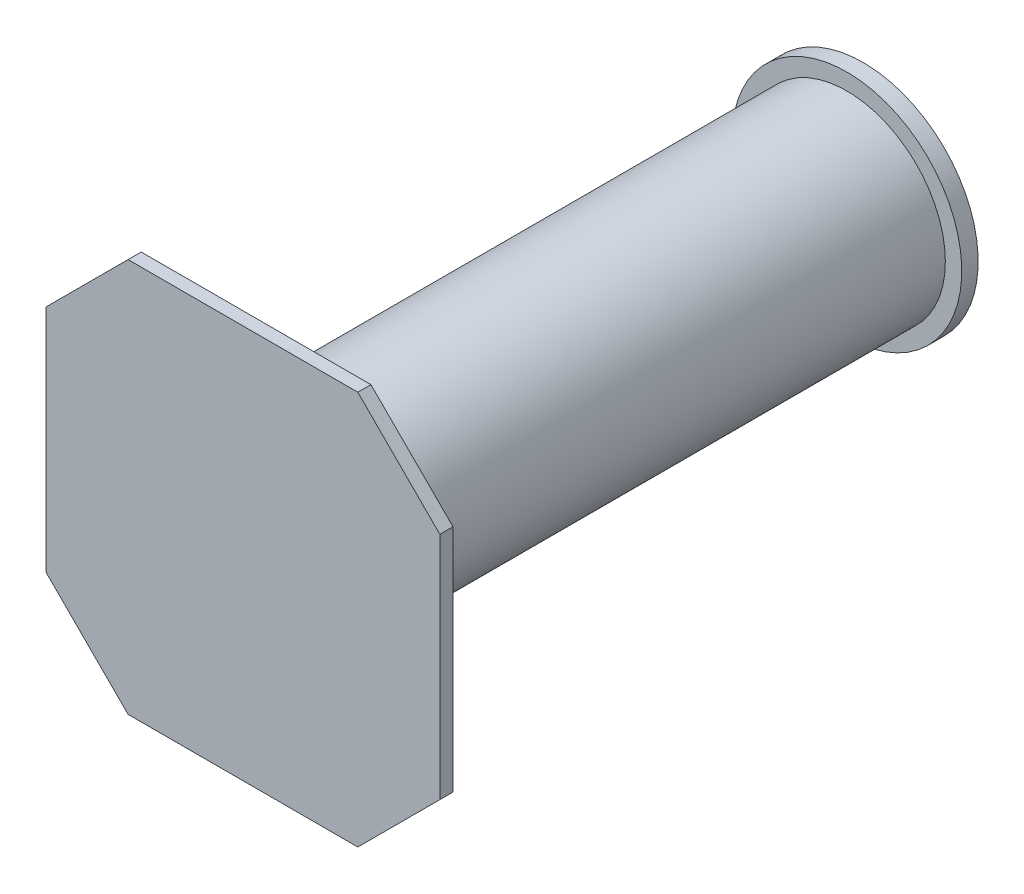
ISO-10303-21;
HEADER;
FILE_DESCRIPTION(('STEP AP214'),'2;1');
FILE_NAME('part.step','',(''),(''),'','','');
FILE_SCHEMA(('AUTOMOTIVE_DESIGN { 1 0 10303 214 1 1 1 1 }'));
ENDSEC;
DATA;
#1=APPLICATION_CONTEXT('core data for automotive mechanical design processes');
#2=APPLICATION_PROTOCOL_DEFINITION('international standard','automotive_design',2000,#1);
#3=PRODUCT_CONTEXT('',#1,'mechanical');
#4=PRODUCT('Part','Part','',(#3));
#5=PRODUCT_RELATED_PRODUCT_CATEGORY('part','',(#4));
#6=PRODUCT_DEFINITION_FORMATION('','',#4);
#7=PRODUCT_DEFINITION_CONTEXT('part definition',#1,'design');
#8=PRODUCT_DEFINITION('design','',#6,#7);
#9=PRODUCT_DEFINITION_SHAPE('','',#8);
#10=(LENGTH_UNIT() NAMED_UNIT(*) SI_UNIT(.MILLI.,.METRE.));
#11=(NAMED_UNIT(*) PLANE_ANGLE_UNIT() SI_UNIT($,.RADIAN.));
#12=(NAMED_UNIT(*) SI_UNIT($,.STERADIAN.) SOLID_ANGLE_UNIT());
#13=UNCERTAINTY_MEASURE_WITH_UNIT(LENGTH_MEASURE(1.E-05),#10,'distance_accuracy_value','');
#14=(GEOMETRIC_REPRESENTATION_CONTEXT(3) GLOBAL_UNCERTAINTY_ASSIGNED_CONTEXT((#13)) GLOBAL_UNIT_ASSIGNED_CONTEXT((#10,
#11,#12)) REPRESENTATION_CONTEXT('',''));
#15=CARTESIAN_POINT('',(0.,0.,0.));
#16=DIRECTION('',(0.,0.,1.));
#17=DIRECTION('',(1.,0.,0.));
#18=AXIS2_PLACEMENT_3D('',#15,#16,#17);
#19=CARTESIAN_POINT('',(0.,0.,360.));
#20=DIRECTION('',(0.,0.,-1.));
#21=DIRECTION('',(-1.,0.,0.));
#22=AXIS2_PLACEMENT_3D('',#19,#20,#21);
#23=CYLINDRICAL_SURFACE('',#22,60.);
#24=CARTESIAN_POINT('',(0.,0.,360.));
#25=DIRECTION('',(0.,0.,1.));
#26=DIRECTION('',(1.,0.,0.));
#27=AXIS2_PLACEMENT_3D('',#24,#25,#26);
#28=CIRCLE('',#27,60.);
#29=CARTESIAN_POINT('',(60.,0.,360.));
#30=VERTEX_POINT('',#29);
#31=EDGE_CURVE('E11',#30,#30,#28,.T.);
#32=ORIENTED_EDGE('',*,*,#31,.F.);
#33=EDGE_LOOP('',(#32));
#34=FACE_BOUND('',#33,.T.);
#35=CARTESIAN_POINT('',(0.,0.,0.));
#36=DIRECTION('',(0.,0.,1.));
#37=DIRECTION('',(1.,0.,0.));
#38=AXIS2_PLACEMENT_3D('',#35,#36,#37);
#39=CIRCLE('',#38,60.);
#40=CARTESIAN_POINT('',(60.,0.,0.));
#41=VERTEX_POINT('',#40);
#42=EDGE_CURVE('E39',#41,#41,#39,.T.);
#43=ORIENTED_EDGE('',*,*,#42,.T.);
#44=EDGE_LOOP('',(#43));
#45=FACE_BOUND('',#44,.T.);
#46=ADVANCED_FACE('F36',(#34,#45),#23,.T.);
#47=CARTESIAN_POINT('',(0.,0.,-10.));
#48=DIRECTION('',(0.,0.,1.));
#49=DIRECTION('',(1.,0.,0.));
#50=AXIS2_PLACEMENT_3D('',#47,#48,#49);
#51=CYLINDRICAL_SURFACE('',#50,70.);
#52=CARTESIAN_POINT('',(0.,0.,-10.));
#53=DIRECTION('',(0.,0.,-1.));
#54=DIRECTION('',(-1.,0.,0.));
#55=AXIS2_PLACEMENT_3D('',#52,#53,#54);
#56=CIRCLE('',#55,70.);
#57=CARTESIAN_POINT('',(-70.,0.,-10.));
#58=VERTEX_POINT('',#57);
#59=EDGE_CURVE('E163',#58,#58,#56,.T.);
#60=ORIENTED_EDGE('',*,*,#59,.F.);
#61=EDGE_LOOP('',(#60));
#62=FACE_BOUND('',#61,.T.);
#63=CARTESIAN_POINT('',(0.,0.,0.));
#64=DIRECTION('',(0.,0.,-1.));
#65=DIRECTION('',(-1.,0.,0.));
#66=AXIS2_PLACEMENT_3D('',#63,#64,#65);
#67=CIRCLE('',#66,70.);
#68=CARTESIAN_POINT('',(-70.,0.,0.));
#69=VERTEX_POINT('',#68);
#70=EDGE_CURVE('E162',#69,#69,#67,.T.);
#71=ORIENTED_EDGE('',*,*,#70,.T.);
#72=EDGE_LOOP('',(#71));
#73=FACE_BOUND('',#72,.T.);
#74=ADVANCED_FACE('F169',(#62,#73),#51,.T.);
#75=CARTESIAN_POINT('',(0.,0.,-10.));
#76=DIRECTION('',(0.,0.,-1.));
#77=DIRECTION('',(-1.,0.,0.));
#78=AXIS2_PLACEMENT_3D('',#75,#76,#77);
#79=PLANE('',#78);
#80=ORIENTED_EDGE('',*,*,#59,.T.);
#81=EDGE_LOOP('',(#80));
#82=FACE_BOUND('',#81,.T.);
#83=ADVANCED_FACE('F174',(#82),#79,.T.);
#84=CARTESIAN_POINT('',(0.,0.,0.));
#85=DIRECTION('',(0.,0.,-1.));
#86=DIRECTION('',(-1.,0.,0.));
#87=AXIS2_PLACEMENT_3D('',#84,#85,#86);
#88=PLANE('',#87);
#89=ORIENTED_EDGE('',*,*,#42,.F.);
#90=EDGE_LOOP('',(#89));
#91=FACE_BOUND('',#90,.T.);
#92=ORIENTED_EDGE('',*,*,#70,.F.);
#93=EDGE_LOOP('',(#92));
#94=FACE_BOUND('',#93,.T.);
#95=ADVANCED_FACE('F171',(#91,#94),#88,.F.);
#96=CARTESIAN_POINT('',(70.,120.,368.));
#97=DIRECTION('',(0.,-1.,0.));
#98=DIRECTION('',(1.,0.,0.));
#99=AXIS2_PLACEMENT_3D('',#96,#97,#98);
#100=PLANE('',#99);
#101=DIRECTION('',(-1.,0.,0.));
#102=VECTOR('',#101,1.);
#103=CARTESIAN_POINT('',(70.,120.,360.));
#104=LINE('',#103,#102);
#105=CARTESIAN_POINT('',(70.,120.,360.));
#106=VERTEX_POINT('',#105);
#107=CARTESIAN_POINT('',(-70.,120.,360.));
#108=VERTEX_POINT('',#107);
#109=EDGE_CURVE('E133',#106,#108,#104,.T.);
#110=ORIENTED_EDGE('',*,*,#109,.T.);
#111=DIRECTION('',(0.,0.,-1.));
#112=VECTOR('',#111,1.);
#113=CARTESIAN_POINT('',(-70.,120.,368.));
#114=LINE('',#113,#112);
#115=CARTESIAN_POINT('',(-70.,120.,368.));
#116=VERTEX_POINT('',#115);
#117=EDGE_CURVE('E160',#116,#108,#114,.T.);
#118=ORIENTED_EDGE('',*,*,#117,.F.);
#119=DIRECTION('',(-1.,0.,0.));
#120=VECTOR('',#119,1.);
#121=CARTESIAN_POINT('',(70.,120.,368.));
#122=LINE('',#121,#120);
#123=CARTESIAN_POINT('',(70.,120.,368.));
#124=VERTEX_POINT('',#123);
#125=EDGE_CURVE('E147',#124,#116,#122,.T.);
#126=ORIENTED_EDGE('',*,*,#125,.F.);
#127=DIRECTION('',(0.,0.,-1.));
#128=VECTOR('',#127,1.);
#129=CARTESIAN_POINT('',(70.,120.,368.));
#130=LINE('',#129,#128);
#131=EDGE_CURVE('E129',#124,#106,#130,.T.);
#132=ORIENTED_EDGE('',*,*,#131,.T.);
#133=EDGE_LOOP('',(#110,#118,#126,#132));
#134=FACE_BOUND('',#133,.T.);
#135=ADVANCED_FACE('F173',(#134),#100,.F.);
#136=CARTESIAN_POINT('',(-70.,120.,368.));
#137=DIRECTION('',(0.707106781186547,-0.707106781186547,0.));
#138=DIRECTION('',(0.707106781186548,0.707106781186548,0.));
#139=AXIS2_PLACEMENT_3D('',#136,#137,#138);
#140=PLANE('',#139);
#141=DIRECTION('',(-0.707106781186547,-0.707106781186547,0.));
#142=VECTOR('',#141,1.);
#143=CARTESIAN_POINT('',(-70.,120.,360.));
#144=LINE('',#143,#142);
#145=CARTESIAN_POINT('',(-120.,70.,360.));
#146=VERTEX_POINT('',#145);
#147=EDGE_CURVE('E136',#108,#146,#144,.T.);
#148=ORIENTED_EDGE('',*,*,#147,.T.);
#149=DIRECTION('',(0.,0.,-1.));
#150=VECTOR('',#149,1.);
#151=CARTESIAN_POINT('',(-120.,70.,368.));
#152=LINE('',#151,#150);
#153=CARTESIAN_POINT('',(-120.,70.,368.));
#154=VERTEX_POINT('',#153);
#155=EDGE_CURVE('E157',#154,#146,#152,.T.);
#156=ORIENTED_EDGE('',*,*,#155,.F.);
#157=DIRECTION('',(-0.707106781186547,-0.707106781186547,0.));
#158=VECTOR('',#157,1.);
#159=CARTESIAN_POINT('',(-70.,120.,368.));
#160=LINE('',#159,#158);
#161=EDGE_CURVE('E96',#116,#154,#160,.T.);
#162=ORIENTED_EDGE('',*,*,#161,.F.);
#163=ORIENTED_EDGE('',*,*,#117,.T.);
#164=EDGE_LOOP('',(#148,#156,#162,#163));
#165=FACE_BOUND('',#164,.T.);
#166=ADVANCED_FACE('F181',(#165),#140,.F.);
#167=CARTESIAN_POINT('',(-120.,70.,368.));
#168=DIRECTION('',(1.,0.,0.));
#169=DIRECTION('',(0.,1.,0.));
#170=AXIS2_PLACEMENT_3D('',#167,#168,#169);
#171=PLANE('',#170);
#172=DIRECTION('',(0.,-1.,0.));
#173=VECTOR('',#172,1.);
#174=CARTESIAN_POINT('',(-120.,70.,360.));
#175=LINE('',#174,#173);
#176=CARTESIAN_POINT('',(-120.,-70.,360.));
#177=VERTEX_POINT('',#176);
#178=EDGE_CURVE('E138',#146,#177,#175,.T.);
#179=ORIENTED_EDGE('',*,*,#178,.T.);
#180=DIRECTION('',(0.,0.,-1.));
#181=VECTOR('',#180,1.);
#182=CARTESIAN_POINT('',(-120.,-70.,368.));
#183=LINE('',#182,#181);
#184=CARTESIAN_POINT('',(-120.,-70.,368.));
#185=VERTEX_POINT('',#184);
#186=EDGE_CURVE('E154',#185,#177,#183,.T.);
#187=ORIENTED_EDGE('',*,*,#186,.F.);
#188=DIRECTION('',(0.,-1.,0.));
#189=VECTOR('',#188,1.);
#190=CARTESIAN_POINT('',(-120.,70.,368.));
#191=LINE('',#190,#189);
#192=EDGE_CURVE('E234',#154,#185,#191,.T.);
#193=ORIENTED_EDGE('',*,*,#192,.F.);
#194=ORIENTED_EDGE('',*,*,#155,.T.);
#195=EDGE_LOOP('',(#179,#187,#193,#194));
#196=FACE_BOUND('',#195,.T.);
#197=ADVANCED_FACE('F224',(#196),#171,.F.);
#198=CARTESIAN_POINT('',(-70.,-120.,368.));
#199=DIRECTION('',(0.707106781186547,0.707106781186547,0.));
#200=DIRECTION('',(-0.707106781186548,0.707106781186548,0.));
#201=AXIS2_PLACEMENT_3D('',#198,#199,#200);
#202=PLANE('',#201);
#203=DIRECTION('',(0.707106781186547,-0.707106781186547,0.));
#204=VECTOR('',#203,1.);
#205=CARTESIAN_POINT('',(-70.,-120.,360.));
#206=LINE('',#205,#204);
#207=CARTESIAN_POINT('',(-70.,-120.,360.));
#208=VERTEX_POINT('',#207);
#209=EDGE_CURVE('E140',#177,#208,#206,.T.);
#210=ORIENTED_EDGE('',*,*,#209,.T.);
#211=DIRECTION('',(0.,0.,-1.));
#212=VECTOR('',#211,1.);
#213=CARTESIAN_POINT('',(-70.,-120.,368.));
#214=LINE('',#213,#212);
#215=CARTESIAN_POINT('',(-70.,-120.,368.));
#216=VERTEX_POINT('',#215);
#217=EDGE_CURVE('E151',#216,#208,#214,.T.);
#218=ORIENTED_EDGE('',*,*,#217,.F.);
#219=DIRECTION('',(0.707106781186547,-0.707106781186547,0.));
#220=VECTOR('',#219,1.);
#221=CARTESIAN_POINT('',(-70.,-120.,368.));
#222=LINE('',#221,#220);
#223=EDGE_CURVE('E239',#185,#216,#222,.T.);
#224=ORIENTED_EDGE('',*,*,#223,.F.);
#225=ORIENTED_EDGE('',*,*,#186,.T.);
#226=EDGE_LOOP('',(#210,#218,#224,#225));
#227=FACE_BOUND('',#226,.T.);
#228=ADVANCED_FACE('F220',(#227),#202,.F.);
#229=CARTESIAN_POINT('',(70.,-120.,368.));
#230=DIRECTION('',(0.,1.,0.));
#231=DIRECTION('',(-1.,0.,0.));
#232=AXIS2_PLACEMENT_3D('',#229,#230,#231);
#233=PLANE('',#232);
#234=DIRECTION('',(1.,0.,0.));
#235=VECTOR('',#234,1.);
#236=CARTESIAN_POINT('',(70.,-120.,360.));
#237=LINE('',#236,#235);
#238=CARTESIAN_POINT('',(70.,-120.,360.));
#239=VERTEX_POINT('',#238);
#240=EDGE_CURVE('E142',#208,#239,#237,.T.);
#241=ORIENTED_EDGE('',*,*,#240,.T.);
#242=DIRECTION('',(0.,0.,-1.));
#243=VECTOR('',#242,1.);
#244=CARTESIAN_POINT('',(70.,-120.,368.));
#245=LINE('',#244,#243);
#246=CARTESIAN_POINT('',(70.,-120.,368.));
#247=VERTEX_POINT('',#246);
#248=EDGE_CURVE('E124',#247,#239,#245,.T.);
#249=ORIENTED_EDGE('',*,*,#248,.F.);
#250=DIRECTION('',(1.,0.,0.));
#251=VECTOR('',#250,1.);
#252=CARTESIAN_POINT('',(70.,-120.,368.));
#253=LINE('',#252,#251);
#254=EDGE_CURVE('E115',#216,#247,#253,.T.);
#255=ORIENTED_EDGE('',*,*,#254,.F.);
#256=ORIENTED_EDGE('',*,*,#217,.T.);
#257=EDGE_LOOP('',(#241,#249,#255,#256));
#258=FACE_BOUND('',#257,.T.);
#259=ADVANCED_FACE('F217',(#258),#233,.F.);
#260=CARTESIAN_POINT('',(120.,-70.,368.));
#261=DIRECTION('',(-0.707106781186548,0.707106781186547,0.));
#262=DIRECTION('',(-0.707106781186547,-0.707106781186548,0.));
#263=AXIS2_PLACEMENT_3D('',#260,#261,#262);
#264=PLANE('',#263);
#265=DIRECTION('',(0.707106781186547,0.707106781186548,0.));
#266=VECTOR('',#265,1.);
#267=CARTESIAN_POINT('',(120.,-70.,360.));
#268=LINE('',#267,#266);
#269=CARTESIAN_POINT('',(120.,-70.,360.));
#270=VERTEX_POINT('',#269);
#271=EDGE_CURVE('E123',#239,#270,#268,.T.);
#272=ORIENTED_EDGE('',*,*,#271,.T.);
#273=DIRECTION('',(0.,0.,-1.));
#274=VECTOR('',#273,1.);
#275=CARTESIAN_POINT('',(120.,-70.,368.));
#276=LINE('',#275,#274);
#277=CARTESIAN_POINT('',(120.,-70.,368.));
#278=VERTEX_POINT('',#277);
#279=EDGE_CURVE('E120',#278,#270,#276,.T.);
#280=ORIENTED_EDGE('',*,*,#279,.F.);
#281=DIRECTION('',(0.707106781186547,0.707106781186548,0.));
#282=VECTOR('',#281,1.);
#283=CARTESIAN_POINT('',(120.,-70.,368.));
#284=LINE('',#283,#282);
#285=EDGE_CURVE('E109',#247,#278,#284,.T.);
#286=ORIENTED_EDGE('',*,*,#285,.F.);
#287=ORIENTED_EDGE('',*,*,#248,.T.);
#288=EDGE_LOOP('',(#272,#280,#286,#287));
#289=FACE_BOUND('',#288,.T.);
#290=ADVANCED_FACE('F121',(#289),#264,.F.);
#291=CARTESIAN_POINT('',(120.,70.,368.));
#292=DIRECTION('',(-1.,0.,0.));
#293=DIRECTION('',(0.,-1.,0.));
#294=AXIS2_PLACEMENT_3D('',#291,#292,#293);
#295=PLANE('',#294);
#296=DIRECTION('',(0.,1.,0.));
#297=VECTOR('',#296,1.);
#298=CARTESIAN_POINT('',(120.,70.,360.));
#299=LINE('',#298,#297);
#300=CARTESIAN_POINT('',(120.,70.,360.));
#301=VERTEX_POINT('',#300);
#302=EDGE_CURVE('E81',#270,#301,#299,.T.);
#303=ORIENTED_EDGE('',*,*,#302,.T.);
#304=DIRECTION('',(0.,0.,-1.));
#305=VECTOR('',#304,1.);
#306=CARTESIAN_POINT('',(120.,70.,368.));
#307=LINE('',#306,#305);
#308=CARTESIAN_POINT('',(120.,70.,368.));
#309=VERTEX_POINT('',#308);
#310=EDGE_CURVE('E125',#309,#301,#307,.T.);
#311=ORIENTED_EDGE('',*,*,#310,.F.);
#312=DIRECTION('',(0.,1.,0.));
#313=VECTOR('',#312,1.);
#314=CARTESIAN_POINT('',(120.,70.,368.));
#315=LINE('',#314,#313);
#316=EDGE_CURVE('E113',#278,#309,#315,.T.);
#317=ORIENTED_EDGE('',*,*,#316,.F.);
#318=ORIENTED_EDGE('',*,*,#279,.T.);
#319=EDGE_LOOP('',(#303,#311,#317,#318));
#320=FACE_BOUND('',#319,.T.);
#321=ADVANCED_FACE('F127',(#320),#295,.F.);
#322=CARTESIAN_POINT('',(120.,70.,368.));
#323=DIRECTION('',(-0.707106781186547,-0.707106781186548,0.));
#324=DIRECTION('',(0.707106781186548,-0.707106781186547,0.));
#325=AXIS2_PLACEMENT_3D('',#322,#323,#324);
#326=PLANE('',#325);
#327=DIRECTION('',(-0.707106781186548,0.707106781186547,0.));
#328=VECTOR('',#327,1.);
#329=CARTESIAN_POINT('',(120.,70.,360.));
#330=LINE('',#329,#328);
#331=EDGE_CURVE('E87',#301,#106,#330,.T.);
#332=ORIENTED_EDGE('',*,*,#331,.T.);
#333=ORIENTED_EDGE('',*,*,#131,.F.);
#334=DIRECTION('',(-0.707106781186548,0.707106781186547,0.));
#335=VECTOR('',#334,1.);
#336=CARTESIAN_POINT('',(120.,70.,368.));
#337=LINE('',#336,#335);
#338=EDGE_CURVE('E52',#309,#124,#337,.T.);
#339=ORIENTED_EDGE('',*,*,#338,.F.);
#340=ORIENTED_EDGE('',*,*,#310,.T.);
#341=EDGE_LOOP('',(#332,#333,#339,#340));
#342=FACE_BOUND('',#341,.T.);
#343=ADVANCED_FACE('F205',(#342),#326,.F.);
#344=CARTESIAN_POINT('',(0.,0.,368.));
#345=DIRECTION('',(0.,0.,1.));
#346=DIRECTION('',(1.,0.,0.));
#347=AXIS2_PLACEMENT_3D('',#344,#345,#346);
#348=PLANE('',#347);
#349=ORIENTED_EDGE('',*,*,#125,.T.);
#350=ORIENTED_EDGE('',*,*,#161,.T.);
#351=ORIENTED_EDGE('',*,*,#192,.T.);
#352=ORIENTED_EDGE('',*,*,#223,.T.);
#353=ORIENTED_EDGE('',*,*,#254,.T.);
#354=ORIENTED_EDGE('',*,*,#285,.T.);
#355=ORIENTED_EDGE('',*,*,#316,.T.);
#356=ORIENTED_EDGE('',*,*,#338,.T.);
#357=EDGE_LOOP('',(#349,#350,#351,#352,#353,#354,#355,#356));
#358=FACE_BOUND('',#357,.T.);
#359=ADVANCED_FACE('F111',(#358),#348,.T.);
#360=CARTESIAN_POINT('',(0.,0.,360.));
#361=DIRECTION('',(0.,0.,1.));
#362=DIRECTION('',(1.,0.,0.));
#363=AXIS2_PLACEMENT_3D('',#360,#361,#362);
#364=PLANE('',#363);
#365=ORIENTED_EDGE('',*,*,#31,.T.);
#366=EDGE_LOOP('',(#365));
#367=FACE_BOUND('',#366,.T.);
#368=ORIENTED_EDGE('',*,*,#109,.F.);
#369=ORIENTED_EDGE('',*,*,#331,.F.);
#370=ORIENTED_EDGE('',*,*,#302,.F.);
#371=ORIENTED_EDGE('',*,*,#271,.F.);
#372=ORIENTED_EDGE('',*,*,#240,.F.);
#373=ORIENTED_EDGE('',*,*,#209,.F.);
#374=ORIENTED_EDGE('',*,*,#178,.F.);
#375=ORIENTED_EDGE('',*,*,#147,.F.);
#376=EDGE_LOOP('',(#368,#369,#370,#371,#372,#373,#374,#375));
#377=FACE_BOUND('',#376,.T.);
#378=ADVANCED_FACE('F197',(#367,#377),#364,.F.);
#379=CLOSED_SHELL('',(#46,#74,#83,#95,#135,#166,#197,#228,#259,#290,#321,#343,#359,#378));
#380=MANIFOLD_SOLID_BREP('B2',#379);
#381=ADVANCED_BREP_SHAPE_REPRESENTATION('',(#18,#380),#14);
#382=SHAPE_DEFINITION_REPRESENTATION(#9,#381);
ENDSEC;
END-ISO-10303-21;
